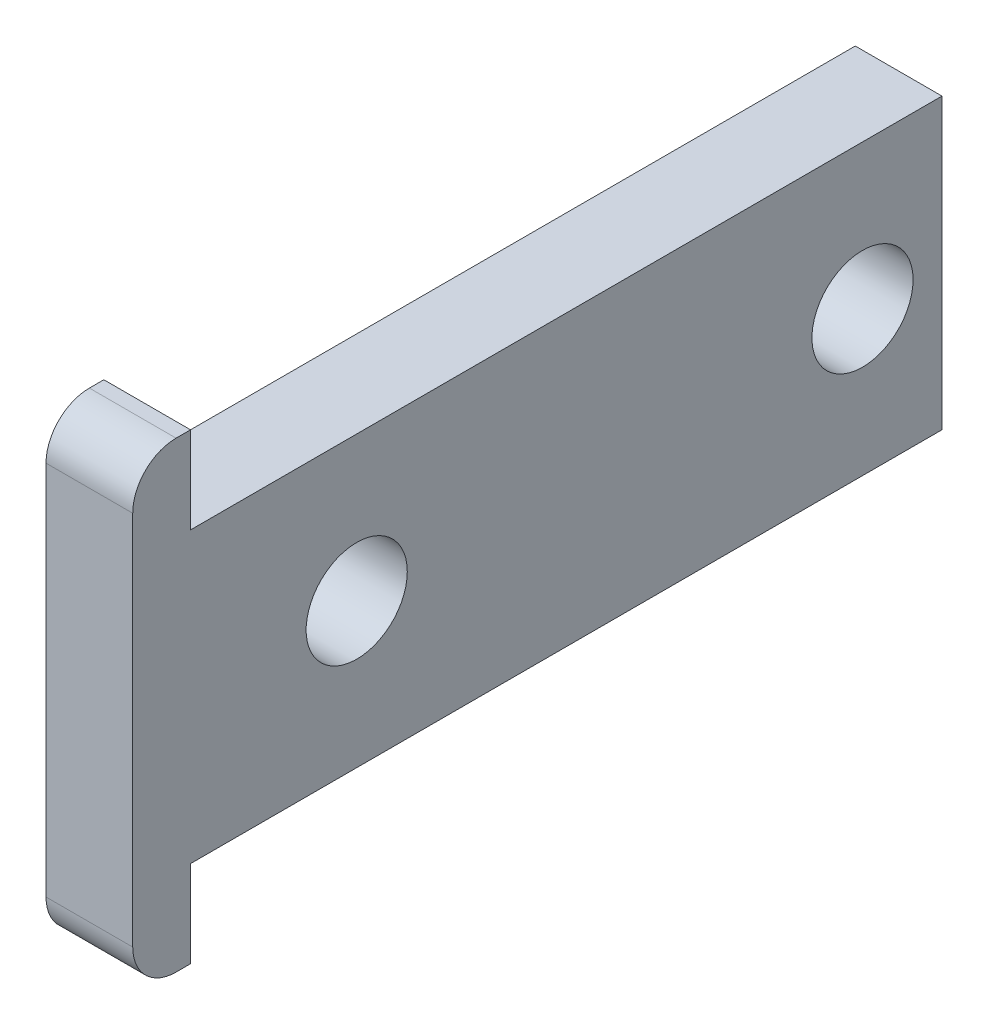
ISO-10303-21;
HEADER;
FILE_DESCRIPTION(('STEP AP214'),'2;1');
FILE_NAME('part.step','',(''),(''),'','','');
FILE_SCHEMA(('AUTOMOTIVE_DESIGN { 1 0 10303 214 1 1 1 1 }'));
ENDSEC;
DATA;
#1=APPLICATION_CONTEXT('core data for automotive mechanical design processes');
#2=APPLICATION_PROTOCOL_DEFINITION('international standard','automotive_design',2000,#1);
#3=PRODUCT_CONTEXT('',#1,'mechanical');
#4=PRODUCT('Part','Part','',(#3));
#5=PRODUCT_RELATED_PRODUCT_CATEGORY('part','',(#4));
#6=PRODUCT_DEFINITION_FORMATION('','',#4);
#7=PRODUCT_DEFINITION_CONTEXT('part definition',#1,'design');
#8=PRODUCT_DEFINITION('design','',#6,#7);
#9=PRODUCT_DEFINITION_SHAPE('','',#8);
#10=(LENGTH_UNIT() NAMED_UNIT(*) SI_UNIT(.MILLI.,.METRE.));
#11=(NAMED_UNIT(*) PLANE_ANGLE_UNIT() SI_UNIT($,.RADIAN.));
#12=(NAMED_UNIT(*) SI_UNIT($,.STERADIAN.) SOLID_ANGLE_UNIT());
#13=UNCERTAINTY_MEASURE_WITH_UNIT(LENGTH_MEASURE(1.E-05),#10,'distance_accuracy_value','');
#14=(GEOMETRIC_REPRESENTATION_CONTEXT(3) GLOBAL_UNCERTAINTY_ASSIGNED_CONTEXT((#13)) GLOBAL_UNIT_ASSIGNED_CONTEXT((#10,
#11,#12)) REPRESENTATION_CONTEXT('',''));
#15=CARTESIAN_POINT('',(0.,0.,0.));
#16=DIRECTION('',(0.,0.,1.));
#17=DIRECTION('',(1.,0.,0.));
#18=AXIS2_PLACEMENT_3D('',#15,#16,#17);
#19=CARTESIAN_POINT('',(3.,5.,0.));
#20=DIRECTION('',(0.,1.,0.));
#21=DIRECTION('',(0.,0.,1.));
#22=AXIS2_PLACEMENT_3D('',#19,#20,#21);
#23=PLANE('',#22);
#24=DIRECTION('',(0.,0.,-1.));
#25=VECTOR('',#24,1.);
#26=CARTESIAN_POINT('',(0.,5.,0.));
#27=LINE('',#26,#25);
#28=CARTESIAN_POINT('',(0.,5.,14.5));
#29=VERTEX_POINT('',#28);
#30=CARTESIAN_POINT('',(0.,5.,-11.5));
#31=VERTEX_POINT('',#30);
#32=EDGE_CURVE('E9',#29,#31,#27,.T.);
#33=ORIENTED_EDGE('',*,*,#32,.F.);
#34=DIRECTION('',(-1.,0.,0.));
#35=VECTOR('',#34,1.);
#36=CARTESIAN_POINT('',(3.,5.,14.5));
#37=LINE('',#36,#35);
#38=CARTESIAN_POINT('',(3.,5.,14.5));
#39=VERTEX_POINT('',#38);
#40=EDGE_CURVE('E22',#39,#29,#37,.T.);
#41=ORIENTED_EDGE('',*,*,#40,.F.);
#42=DIRECTION('',(0.,0.,-1.));
#43=VECTOR('',#42,1.);
#44=CARTESIAN_POINT('',(3.,5.,0.));
#45=LINE('',#44,#43);
#46=CARTESIAN_POINT('',(3.,5.,-11.5));
#47=VERTEX_POINT('',#46);
#48=EDGE_CURVE('E178',#39,#47,#45,.T.);
#49=ORIENTED_EDGE('',*,*,#48,.T.);
#50=DIRECTION('',(-1.,0.,0.));
#51=VECTOR('',#50,1.);
#52=CARTESIAN_POINT('',(3.,5.,-11.5));
#53=LINE('',#52,#51);
#54=EDGE_CURVE('E176',#47,#31,#53,.T.);
#55=ORIENTED_EDGE('',*,*,#54,.T.);
#56=EDGE_LOOP('',(#33,#41,#49,#55));
#57=FACE_BOUND('',#56,.T.);
#58=ADVANCED_FACE('F15',(#57),#23,.T.);
#59=CARTESIAN_POINT('',(3.,-5.,0.));
#60=DIRECTION('',(0.,1.,0.));
#61=DIRECTION('',(0.,0.,1.));
#62=AXIS2_PLACEMENT_3D('',#59,#60,#61);
#63=PLANE('',#62);
#64=DIRECTION('',(0.,0.,-1.));
#65=VECTOR('',#64,1.);
#66=CARTESIAN_POINT('',(0.,-5.,0.));
#67=LINE('',#66,#65);
#68=CARTESIAN_POINT('',(0.,-5.,14.5));
#69=VERTEX_POINT('',#68);
#70=CARTESIAN_POINT('',(0.,-5.,-11.5));
#71=VERTEX_POINT('',#70);
#72=EDGE_CURVE('E174',#69,#71,#67,.T.);
#73=ORIENTED_EDGE('',*,*,#72,.T.);
#74=DIRECTION('',(-1.,0.,0.));
#75=VECTOR('',#74,1.);
#76=CARTESIAN_POINT('',(3.,-5.,-11.5));
#77=LINE('',#76,#75);
#78=CARTESIAN_POINT('',(3.,-5.,-11.5));
#79=VERTEX_POINT('',#78);
#80=EDGE_CURVE('E171',#79,#71,#77,.T.);
#81=ORIENTED_EDGE('',*,*,#80,.F.);
#82=DIRECTION('',(0.,0.,-1.));
#83=VECTOR('',#82,1.);
#84=CARTESIAN_POINT('',(3.,-5.,0.));
#85=LINE('',#84,#83);
#86=CARTESIAN_POINT('',(3.,-5.,14.5));
#87=VERTEX_POINT('',#86);
#88=EDGE_CURVE('E168',#87,#79,#85,.T.);
#89=ORIENTED_EDGE('',*,*,#88,.F.);
#90=DIRECTION('',(-1.,0.,0.));
#91=VECTOR('',#90,1.);
#92=CARTESIAN_POINT('',(3.,-5.,14.5));
#93=LINE('',#92,#91);
#94=EDGE_CURVE('E166',#87,#69,#93,.T.);
#95=ORIENTED_EDGE('',*,*,#94,.T.);
#96=EDGE_LOOP('',(#73,#81,#89,#95));
#97=FACE_BOUND('',#96,.T.);
#98=ADVANCED_FACE('F209',(#97),#63,.F.);
#99=CARTESIAN_POINT('',(3.,0.,8.75));
#100=DIRECTION('',(-1.,0.,0.));
#101=DIRECTION('',(0.,0.,1.));
#102=AXIS2_PLACEMENT_3D('',#99,#100,#101);
#103=CYLINDRICAL_SURFACE('',#102,1.75);
#104=CARTESIAN_POINT('',(3.,0.,8.75));
#105=DIRECTION('',(1.,0.,0.));
#106=DIRECTION('',(0.,0.,-1.));
#107=AXIS2_PLACEMENT_3D('',#104,#105,#106);
#108=CIRCLE('',#107,1.75);
#109=CARTESIAN_POINT('',(3.,0.,7.));
#110=VERTEX_POINT('',#109);
#111=EDGE_CURVE('E163',#110,#110,#108,.T.);
#112=ORIENTED_EDGE('',*,*,#111,.T.);
#113=EDGE_LOOP('',(#112));
#114=FACE_BOUND('',#113,.T.);
#115=CARTESIAN_POINT('',(0.,0.,8.75));
#116=DIRECTION('',(1.,0.,0.));
#117=DIRECTION('',(0.,0.,-1.));
#118=AXIS2_PLACEMENT_3D('',#115,#116,#117);
#119=CIRCLE('',#118,1.75);
#120=CARTESIAN_POINT('',(0.,0.,7.));
#121=VERTEX_POINT('',#120);
#122=EDGE_CURVE('E160',#121,#121,#119,.T.);
#123=ORIENTED_EDGE('',*,*,#122,.F.);
#124=EDGE_LOOP('',(#123));
#125=FACE_BOUND('',#124,.T.);
#126=ADVANCED_FACE('F211',(#114,#125),#103,.F.);
#127=CARTESIAN_POINT('',(3.,0.,-11.5));
#128=DIRECTION('',(0.,0.,-1.));
#129=DIRECTION('',(-1.,0.,0.));
#130=AXIS2_PLACEMENT_3D('',#127,#128,#129);
#131=PLANE('',#130);
#132=DIRECTION('',(0.,-1.,0.));
#133=VECTOR('',#132,1.);
#134=CARTESIAN_POINT('',(0.,0.,-11.5));
#135=LINE('',#134,#133);
#136=EDGE_CURVE('E157',#31,#71,#135,.T.);
#137=ORIENTED_EDGE('',*,*,#136,.F.);
#138=ORIENTED_EDGE('',*,*,#54,.F.);
#139=DIRECTION('',(0.,-1.,0.));
#140=VECTOR('',#139,1.);
#141=CARTESIAN_POINT('',(3.,0.,-11.5));
#142=LINE('',#141,#140);
#143=EDGE_CURVE('E154',#47,#79,#142,.T.);
#144=ORIENTED_EDGE('',*,*,#143,.T.);
#145=ORIENTED_EDGE('',*,*,#80,.T.);
#146=EDGE_LOOP('',(#137,#138,#144,#145));
#147=FACE_BOUND('',#146,.T.);
#148=ADVANCED_FACE('F192',(#147),#131,.T.);
#149=CARTESIAN_POINT('',(3.,0.,-8.75));
#150=DIRECTION('',(-1.,0.,0.));
#151=DIRECTION('',(0.,0.,1.));
#152=AXIS2_PLACEMENT_3D('',#149,#150,#151);
#153=CYLINDRICAL_SURFACE('',#152,1.75);
#154=CARTESIAN_POINT('',(3.,0.,-8.75));
#155=DIRECTION('',(1.,0.,0.));
#156=DIRECTION('',(0.,0.,-1.));
#157=AXIS2_PLACEMENT_3D('',#154,#155,#156);
#158=CIRCLE('',#157,1.75);
#159=CARTESIAN_POINT('',(3.,0.,-10.5));
#160=VERTEX_POINT('',#159);
#161=EDGE_CURVE('E151',#160,#160,#158,.T.);
#162=ORIENTED_EDGE('',*,*,#161,.T.);
#163=EDGE_LOOP('',(#162));
#164=FACE_BOUND('',#163,.T.);
#165=CARTESIAN_POINT('',(0.,0.,-8.75));
#166=DIRECTION('',(1.,0.,0.));
#167=DIRECTION('',(0.,0.,-1.));
#168=AXIS2_PLACEMENT_3D('',#165,#166,#167);
#169=CIRCLE('',#168,1.75);
#170=CARTESIAN_POINT('',(0.,0.,-10.5));
#171=VERTEX_POINT('',#170);
#172=EDGE_CURVE('E148',#171,#171,#169,.T.);
#173=ORIENTED_EDGE('',*,*,#172,.F.);
#174=EDGE_LOOP('',(#173));
#175=FACE_BOUND('',#174,.T.);
#176=ADVANCED_FACE('F223',(#164,#175),#153,.F.);
#177=CARTESIAN_POINT('',(3.,0.,0.));
#178=DIRECTION('',(1.,0.,0.));
#179=DIRECTION('',(0.,1.,0.));
#180=AXIS2_PLACEMENT_3D('',#177,#178,#179);
#181=PLANE('',#180);
#182=DIRECTION('',(0.,0.,1.));
#183=VECTOR('',#182,1.);
#184=CARTESIAN_POINT('',(3.,8.,15.5));
#185=LINE('',#184,#183);
#186=CARTESIAN_POINT('',(3.,8.,14.5));
#187=VERTEX_POINT('',#186);
#188=CARTESIAN_POINT('',(3.,8.,15.));
#189=VERTEX_POINT('',#188);
#190=EDGE_CURVE('E146',#187,#189,#185,.T.);
#191=ORIENTED_EDGE('',*,*,#190,.T.);
#192=CARTESIAN_POINT('',(3.,6.5,15.));
#193=DIRECTION('',(1.,0.,0.));
#194=DIRECTION('',(0.,0.,-1.));
#195=AXIS2_PLACEMENT_3D('',#192,#193,#194);
#196=CIRCLE('',#195,1.5);
#197=CARTESIAN_POINT('',(3.,6.5,16.5));
#198=VERTEX_POINT('',#197);
#199=EDGE_CURVE('E144',#189,#198,#196,.T.);
#200=ORIENTED_EDGE('',*,*,#199,.T.);
#201=DIRECTION('',(0.,1.,0.));
#202=VECTOR('',#201,1.);
#203=CARTESIAN_POINT('',(3.,0.,16.5));
#204=LINE('',#203,#202);
#205=CARTESIAN_POINT('',(3.,-6.5,16.5));
#206=VERTEX_POINT('',#205);
#207=EDGE_CURVE('E142',#206,#198,#204,.T.);
#208=ORIENTED_EDGE('',*,*,#207,.F.);
#209=CARTESIAN_POINT('',(3.,-6.5,15.));
#210=DIRECTION('',(1.,0.,0.));
#211=DIRECTION('',(0.,0.,-1.));
#212=AXIS2_PLACEMENT_3D('',#209,#210,#211);
#213=CIRCLE('',#212,1.5);
#214=CARTESIAN_POINT('',(3.,-8.,15.));
#215=VERTEX_POINT('',#214);
#216=EDGE_CURVE('E113',#206,#215,#213,.T.);
#217=ORIENTED_EDGE('',*,*,#216,.T.);
#218=DIRECTION('',(0.,0.,1.));
#219=VECTOR('',#218,1.);
#220=CARTESIAN_POINT('',(3.,-8.,15.5));
#221=LINE('',#220,#219);
#222=CARTESIAN_POINT('',(3.,-8.,14.5));
#223=VERTEX_POINT('',#222);
#224=EDGE_CURVE('E138',#223,#215,#221,.T.);
#225=ORIENTED_EDGE('',*,*,#224,.F.);
#226=DIRECTION('',(0.,1.,0.));
#227=VECTOR('',#226,1.);
#228=CARTESIAN_POINT('',(3.,0.,14.5));
#229=LINE('',#228,#227);
#230=EDGE_CURVE('E137',#223,#87,#229,.T.);
#231=ORIENTED_EDGE('',*,*,#230,.T.);
#232=ORIENTED_EDGE('',*,*,#88,.T.);
#233=ORIENTED_EDGE('',*,*,#143,.F.);
#234=ORIENTED_EDGE('',*,*,#48,.F.);
#235=EDGE_CURVE('E109',#39,#187,#229,.T.);
#236=ORIENTED_EDGE('',*,*,#235,.T.);
#237=EDGE_LOOP('',(#191,#200,#208,#217,#225,#231,#232,#233,#234,#236));
#238=FACE_BOUND('',#237,.T.);
#239=ORIENTED_EDGE('',*,*,#111,.F.);
#240=EDGE_LOOP('',(#239));
#241=FACE_BOUND('',#240,.T.);
#242=ORIENTED_EDGE('',*,*,#161,.F.);
#243=EDGE_LOOP('',(#242));
#244=FACE_BOUND('',#243,.T.);
#245=ADVANCED_FACE('F186',(#238,#241,#244),#181,.T.);
#246=CARTESIAN_POINT('',(0.,0.,0.));
#247=DIRECTION('',(1.,0.,0.));
#248=DIRECTION('',(0.,1.,0.));
#249=AXIS2_PLACEMENT_3D('',#246,#247,#248);
#250=PLANE('',#249);
#251=DIRECTION('',(0.,1.,0.));
#252=VECTOR('',#251,1.);
#253=CARTESIAN_POINT('',(0.,0.,16.5));
#254=LINE('',#253,#252);
#255=CARTESIAN_POINT('',(0.,-6.5,16.5));
#256=VERTEX_POINT('',#255);
#257=CARTESIAN_POINT('',(0.,6.5,16.5));
#258=VERTEX_POINT('',#257);
#259=EDGE_CURVE('E90',#256,#258,#254,.T.);
#260=ORIENTED_EDGE('',*,*,#259,.T.);
#261=CARTESIAN_POINT('',(0.,6.5,15.));
#262=DIRECTION('',(1.,0.,0.));
#263=DIRECTION('',(0.,0.,-1.));
#264=AXIS2_PLACEMENT_3D('',#261,#262,#263);
#265=CIRCLE('',#264,1.5);
#266=CARTESIAN_POINT('',(0.,8.,15.));
#267=VERTEX_POINT('',#266);
#268=EDGE_CURVE('E110',#258,#267,#265,.F.);
#269=ORIENTED_EDGE('',*,*,#268,.T.);
#270=DIRECTION('',(0.,0.,1.));
#271=VECTOR('',#270,1.);
#272=CARTESIAN_POINT('',(0.,8.,15.5));
#273=LINE('',#272,#271);
#274=CARTESIAN_POINT('',(0.,8.,14.5));
#275=VERTEX_POINT('',#274);
#276=EDGE_CURVE('E132',#275,#267,#273,.T.);
#277=ORIENTED_EDGE('',*,*,#276,.F.);
#278=DIRECTION('',(0.,1.,0.));
#279=VECTOR('',#278,1.);
#280=CARTESIAN_POINT('',(0.,0.,14.5));
#281=LINE('',#280,#279);
#282=EDGE_CURVE('E131',#29,#275,#281,.T.);
#283=ORIENTED_EDGE('',*,*,#282,.F.);
#284=ORIENTED_EDGE('',*,*,#32,.T.);
#285=ORIENTED_EDGE('',*,*,#136,.T.);
#286=ORIENTED_EDGE('',*,*,#72,.F.);
#287=CARTESIAN_POINT('',(0.,-8.,14.5));
#288=VERTEX_POINT('',#287);
#289=EDGE_CURVE('E128',#288,#69,#281,.T.);
#290=ORIENTED_EDGE('',*,*,#289,.F.);
#291=DIRECTION('',(0.,0.,1.));
#292=VECTOR('',#291,1.);
#293=CARTESIAN_POINT('',(0.,-8.,15.5));
#294=LINE('',#293,#292);
#295=CARTESIAN_POINT('',(0.,-8.,15.));
#296=VERTEX_POINT('',#295);
#297=EDGE_CURVE('E93',#288,#296,#294,.T.);
#298=ORIENTED_EDGE('',*,*,#297,.T.);
#299=CARTESIAN_POINT('',(0.,-6.5,15.));
#300=DIRECTION('',(1.,0.,0.));
#301=DIRECTION('',(0.,0.,-1.));
#302=AXIS2_PLACEMENT_3D('',#299,#300,#301);
#303=CIRCLE('',#302,1.5);
#304=EDGE_CURVE('E86',#296,#256,#303,.F.);
#305=ORIENTED_EDGE('',*,*,#304,.T.);
#306=EDGE_LOOP('',(#260,#269,#277,#283,#284,#285,#286,#290,#298,#305));
#307=FACE_BOUND('',#306,.T.);
#308=ORIENTED_EDGE('',*,*,#122,.T.);
#309=EDGE_LOOP('',(#308));
#310=FACE_BOUND('',#309,.T.);
#311=ORIENTED_EDGE('',*,*,#172,.T.);
#312=EDGE_LOOP('',(#311));
#313=FACE_BOUND('',#312,.T.);
#314=ADVANCED_FACE('F88',(#307,#310,#313),#250,.F.);
#315=CARTESIAN_POINT('',(0.,0.,14.5));
#316=DIRECTION('',(0.,0.,-1.));
#317=DIRECTION('',(-1.,0.,0.));
#318=AXIS2_PLACEMENT_3D('',#315,#316,#317);
#319=PLANE('',#318);
#320=ORIENTED_EDGE('',*,*,#94,.F.);
#321=ORIENTED_EDGE('',*,*,#230,.F.);
#322=DIRECTION('',(1.,0.,0.));
#323=VECTOR('',#322,1.);
#324=CARTESIAN_POINT('',(0.,-8.,14.5));
#325=LINE('',#324,#323);
#326=EDGE_CURVE('E98',#288,#223,#325,.T.);
#327=ORIENTED_EDGE('',*,*,#326,.F.);
#328=ORIENTED_EDGE('',*,*,#289,.T.);
#329=EDGE_LOOP('',(#320,#321,#327,#328));
#330=FACE_BOUND('',#329,.T.);
#331=ADVANCED_FACE('F207',(#330),#319,.T.);
#332=CARTESIAN_POINT('',(0.,-8.,15.5));
#333=DIRECTION('',(0.,1.,0.));
#334=DIRECTION('',(0.,0.,1.));
#335=AXIS2_PLACEMENT_3D('',#332,#333,#334);
#336=PLANE('',#335);
#337=ORIENTED_EDGE('',*,*,#224,.T.);
#338=DIRECTION('',(1.,0.,0.));
#339=VECTOR('',#338,1.);
#340=CARTESIAN_POINT('',(0.,-8.,15.));
#341=LINE('',#340,#339);
#342=EDGE_CURVE('E123',#215,#296,#341,.F.);
#343=ORIENTED_EDGE('',*,*,#342,.T.);
#344=ORIENTED_EDGE('',*,*,#297,.F.);
#345=ORIENTED_EDGE('',*,*,#326,.T.);
#346=EDGE_LOOP('',(#337,#343,#344,#345));
#347=FACE_BOUND('',#346,.T.);
#348=ADVANCED_FACE('F203',(#347),#336,.F.);
#349=ORIENTED_EDGE('',*,*,#235,.F.);
#350=ORIENTED_EDGE('',*,*,#40,.T.);
#351=ORIENTED_EDGE('',*,*,#282,.T.);
#352=DIRECTION('',(1.,0.,0.));
#353=VECTOR('',#352,1.);
#354=CARTESIAN_POINT('',(0.,8.,14.5));
#355=LINE('',#354,#353);
#356=EDGE_CURVE('E120',#275,#187,#355,.T.);
#357=ORIENTED_EDGE('',*,*,#356,.T.);
#358=EDGE_LOOP('',(#349,#350,#351,#357));
#359=FACE_BOUND('',#358,.T.);
#360=ADVANCED_FACE('F182',(#359),#319,.T.);
#361=CARTESIAN_POINT('',(0.,8.,15.5));
#362=DIRECTION('',(0.,1.,0.));
#363=DIRECTION('',(0.,0.,1.));
#364=AXIS2_PLACEMENT_3D('',#361,#362,#363);
#365=PLANE('',#364);
#366=ORIENTED_EDGE('',*,*,#276,.T.);
#367=DIRECTION('',(1.,0.,0.));
#368=VECTOR('',#367,1.);
#369=CARTESIAN_POINT('',(3.,8.,15.));
#370=LINE('',#369,#368);
#371=EDGE_CURVE('E115',#267,#189,#370,.T.);
#372=ORIENTED_EDGE('',*,*,#371,.T.);
#373=ORIENTED_EDGE('',*,*,#190,.F.);
#374=ORIENTED_EDGE('',*,*,#356,.F.);
#375=EDGE_LOOP('',(#366,#372,#373,#374));
#376=FACE_BOUND('',#375,.T.);
#377=ADVANCED_FACE('F196',(#376),#365,.T.);
#378=CARTESIAN_POINT('',(0.,0.,16.5));
#379=DIRECTION('',(0.,0.,-1.));
#380=DIRECTION('',(-1.,0.,0.));
#381=AXIS2_PLACEMENT_3D('',#378,#379,#380);
#382=PLANE('',#381);
#383=ORIENTED_EDGE('',*,*,#207,.T.);
#384=DIRECTION('',(1.,0.,0.));
#385=VECTOR('',#384,1.);
#386=CARTESIAN_POINT('',(0.,6.5,16.5));
#387=LINE('',#386,#385);
#388=EDGE_CURVE('E107',#198,#258,#387,.F.);
#389=ORIENTED_EDGE('',*,*,#388,.T.);
#390=ORIENTED_EDGE('',*,*,#259,.F.);
#391=DIRECTION('',(1.,0.,0.));
#392=VECTOR('',#391,1.);
#393=CARTESIAN_POINT('',(0.,-6.5,16.5));
#394=LINE('',#393,#392);
#395=EDGE_CURVE('E104',#256,#206,#394,.T.);
#396=ORIENTED_EDGE('',*,*,#395,.T.);
#397=EDGE_LOOP('',(#383,#389,#390,#396));
#398=FACE_BOUND('',#397,.T.);
#399=ADVANCED_FACE('F103',(#398),#382,.F.);
#400=CARTESIAN_POINT('',(0.,6.5,15.));
#401=DIRECTION('',(-1.,0.,0.));
#402=DIRECTION('',(0.,0.,1.));
#403=AXIS2_PLACEMENT_3D('',#400,#401,#402);
#404=CYLINDRICAL_SURFACE('',#403,1.5);
#405=ORIENTED_EDGE('',*,*,#268,.F.);
#406=ORIENTED_EDGE('',*,*,#388,.F.);
#407=ORIENTED_EDGE('',*,*,#199,.F.);
#408=ORIENTED_EDGE('',*,*,#371,.F.);
#409=EDGE_LOOP('',(#405,#406,#407,#408));
#410=FACE_BOUND('',#409,.T.);
#411=ADVANCED_FACE('F199',(#410),#404,.T.);
#412=CARTESIAN_POINT('',(0.,-6.5,15.));
#413=DIRECTION('',(1.,0.,0.));
#414=DIRECTION('',(0.,0.,-1.));
#415=AXIS2_PLACEMENT_3D('',#412,#413,#414);
#416=CYLINDRICAL_SURFACE('',#415,1.5);
#417=ORIENTED_EDGE('',*,*,#304,.F.);
#418=ORIENTED_EDGE('',*,*,#342,.F.);
#419=ORIENTED_EDGE('',*,*,#216,.F.);
#420=ORIENTED_EDGE('',*,*,#395,.F.);
#421=EDGE_LOOP('',(#417,#418,#419,#420));
#422=FACE_BOUND('',#421,.T.);
#423=ADVANCED_FACE('F112',(#422),#416,.T.);
#424=CLOSED_SHELL('',(#58,#98,#126,#148,#176,#245,#314,#331,#348,#360,#377,#399,#411,#423));
#425=MANIFOLD_SOLID_BREP('B1',#424);
#426=ADVANCED_BREP_SHAPE_REPRESENTATION('',(#18,#425),#14);
#427=SHAPE_DEFINITION_REPRESENTATION(#9,#426);
ENDSEC;
END-ISO-10303-21;
